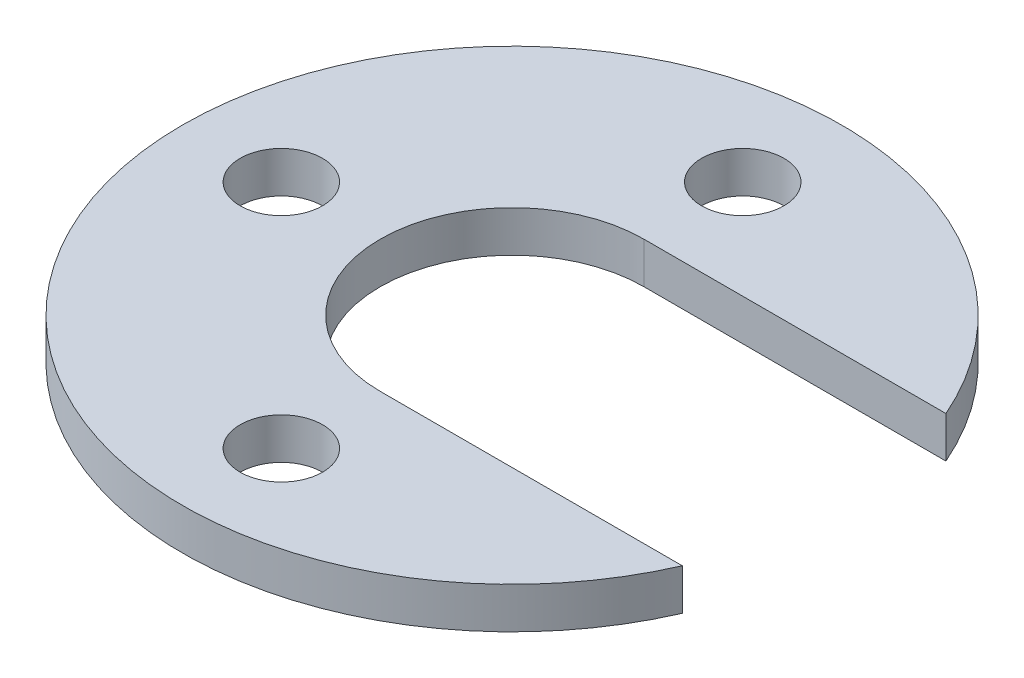
ISO-10303-21;
HEADER;
FILE_DESCRIPTION(('STEP AP214'),'2;1');
FILE_NAME('part.step','',(''),(''),'','','');
FILE_SCHEMA(('AUTOMOTIVE_DESIGN { 1 0 10303 214 1 1 1 1 }'));
ENDSEC;
DATA;
#1=APPLICATION_CONTEXT('core data for automotive mechanical design processes');
#2=APPLICATION_PROTOCOL_DEFINITION('international standard','automotive_design',2000,#1);
#3=PRODUCT_CONTEXT('',#1,'mechanical');
#4=PRODUCT('Part','Part','',(#3));
#5=PRODUCT_RELATED_PRODUCT_CATEGORY('part','',(#4));
#6=PRODUCT_DEFINITION_FORMATION('','',#4);
#7=PRODUCT_DEFINITION_CONTEXT('part definition',#1,'design');
#8=PRODUCT_DEFINITION('design','',#6,#7);
#9=PRODUCT_DEFINITION_SHAPE('','',#8);
#10=(LENGTH_UNIT() NAMED_UNIT(*) SI_UNIT(.MILLI.,.METRE.));
#11=(NAMED_UNIT(*) PLANE_ANGLE_UNIT() SI_UNIT($,.RADIAN.));
#12=(NAMED_UNIT(*) SI_UNIT($,.STERADIAN.) SOLID_ANGLE_UNIT());
#13=UNCERTAINTY_MEASURE_WITH_UNIT(LENGTH_MEASURE(1.E-05),#10,'distance_accuracy_value','');
#14=(GEOMETRIC_REPRESENTATION_CONTEXT(3) GLOBAL_UNCERTAINTY_ASSIGNED_CONTEXT((#13)) GLOBAL_UNIT_ASSIGNED_CONTEXT((#10,
#11,#12)) REPRESENTATION_CONTEXT('',''));
#15=CARTESIAN_POINT('',(0.,0.,0.));
#16=DIRECTION('',(0.,0.,1.));
#17=DIRECTION('',(1.,0.,0.));
#18=AXIS2_PLACEMENT_3D('',#15,#16,#17);
#19=CARTESIAN_POINT('',(0.,5.,0.));
#20=DIRECTION('',(0.,1.,0.));
#21=DIRECTION('',(0.,0.,1.));
#22=AXIS2_PLACEMENT_3D('',#19,#20,#21);
#23=PLANE('',#22);
#24=CARTESIAN_POINT('',(-1.88404347822423E-13,5.,28.));
#25=DIRECTION('',(0.,1.,0.));
#26=DIRECTION('',(0.,0.,1.));
#27=AXIS2_PLACEMENT_3D('',#24,#25,#26);
#28=CIRCLE('',#27,5.);
#29=CARTESIAN_POINT('',(-1.88404347822423E-13,5.,33.));
#30=VERTEX_POINT('',#29);
#31=EDGE_CURVE('E119',#30,#30,#28,.T.);
#32=ORIENTED_EDGE('',*,*,#31,.F.);
#33=EDGE_LOOP('',(#32));
#34=FACE_BOUND('',#33,.T.);
#35=CARTESIAN_POINT('',(0.,5.,0.));
#36=DIRECTION('',(0.,-1.,0.));
#37=DIRECTION('',(0.,0.,1.));
#38=AXIS2_PLACEMENT_3D('',#35,#36,#37);
#39=CIRCLE('',#38,16.);
#40=CARTESIAN_POINT('',(0.,5.,16.));
#41=VERTEX_POINT('',#40);
#42=CARTESIAN_POINT('',(0.,5.,-16.));
#43=VERTEX_POINT('',#42);
#44=EDGE_CURVE('E89',#41,#43,#39,.T.);
#45=ORIENTED_EDGE('',*,*,#44,.T.);
#46=DIRECTION('',(1.,0.,0.));
#47=VECTOR('',#46,1.);
#48=CARTESIAN_POINT('',(0.,5.,-16.));
#49=LINE('',#48,#47);
#50=CARTESIAN_POINT('',(36.6606055596467,5.,-16.));
#51=VERTEX_POINT('',#50);
#52=EDGE_CURVE('E84',#43,#51,#49,.T.);
#53=ORIENTED_EDGE('',*,*,#52,.T.);
#54=CARTESIAN_POINT('',(0.,5.,0.));
#55=DIRECTION('',(0.,1.,0.));
#56=DIRECTION('',(0.,0.,1.));
#57=AXIS2_PLACEMENT_3D('',#54,#55,#56);
#58=CIRCLE('',#57,40.);
#59=CARTESIAN_POINT('',(36.6606055596467,5.,16.));
#60=VERTEX_POINT('',#59);
#61=EDGE_CURVE('E87',#51,#60,#58,.T.);
#62=ORIENTED_EDGE('',*,*,#61,.T.);
#63=DIRECTION('',(-1.,0.,0.));
#64=VECTOR('',#63,1.);
#65=CARTESIAN_POINT('',(0.,5.,16.));
#66=LINE('',#65,#64);
#67=EDGE_CURVE('E54',#60,#41,#66,.T.);
#68=ORIENTED_EDGE('',*,*,#67,.T.);
#69=EDGE_LOOP('',(#45,#53,#62,#68));
#70=FACE_BOUND('',#69,.T.);
#71=CARTESIAN_POINT('',(0.,5.,-28.));
#72=DIRECTION('',(0.,1.,0.));
#73=DIRECTION('',(0.,0.,1.));
#74=AXIS2_PLACEMENT_3D('',#71,#72,#73);
#75=CIRCLE('',#74,5.);
#76=CARTESIAN_POINT('',(0.,5.,-23.));
#77=VERTEX_POINT('',#76);
#78=EDGE_CURVE('E104',#77,#77,#75,.T.);
#79=ORIENTED_EDGE('',*,*,#78,.F.);
#80=EDGE_LOOP('',(#79));
#81=FACE_BOUND('',#80,.T.);
#82=CARTESIAN_POINT('',(-28.,5.,-2.82696378358077E-13));
#83=DIRECTION('',(0.,1.,0.));
#84=DIRECTION('',(0.,0.,1.));
#85=AXIS2_PLACEMENT_3D('',#82,#83,#84);
#86=CIRCLE('',#85,5.);
#87=CARTESIAN_POINT('',(-28.,5.,4.99999999999972));
#88=VERTEX_POINT('',#87);
#89=EDGE_CURVE('E125',#88,#88,#86,.T.);
#90=ORIENTED_EDGE('',*,*,#89,.F.);
#91=EDGE_LOOP('',(#90));
#92=FACE_BOUND('',#91,.T.);
#93=ADVANCED_FACE('F37',(#34,#70,#81,#92),#23,.T.);
#94=CARTESIAN_POINT('',(0.,0.,0.));
#95=DIRECTION('',(0.,1.,0.));
#96=DIRECTION('',(0.,0.,1.));
#97=AXIS2_PLACEMENT_3D('',#94,#95,#96);
#98=PLANE('',#97);
#99=CARTESIAN_POINT('',(0.,0.,0.));
#100=DIRECTION('',(0.,-1.,0.));
#101=DIRECTION('',(0.,0.,1.));
#102=AXIS2_PLACEMENT_3D('',#99,#100,#101);
#103=CIRCLE('',#102,16.);
#104=CARTESIAN_POINT('',(0.,0.,16.));
#105=VERTEX_POINT('',#104);
#106=CARTESIAN_POINT('',(0.,0.,-16.));
#107=VERTEX_POINT('',#106);
#108=EDGE_CURVE('E101',#105,#107,#103,.T.);
#109=ORIENTED_EDGE('',*,*,#108,.F.);
#110=DIRECTION('',(-1.,0.,0.));
#111=VECTOR('',#110,1.);
#112=CARTESIAN_POINT('',(0.,0.,16.));
#113=LINE('',#112,#111);
#114=CARTESIAN_POINT('',(36.6606055596467,0.,16.));
#115=VERTEX_POINT('',#114);
#116=EDGE_CURVE('E77',#115,#105,#113,.T.);
#117=ORIENTED_EDGE('',*,*,#116,.F.);
#118=CARTESIAN_POINT('',(0.,0.,0.));
#119=DIRECTION('',(0.,1.,0.));
#120=DIRECTION('',(0.,0.,1.));
#121=AXIS2_PLACEMENT_3D('',#118,#119,#120);
#122=CIRCLE('',#121,40.);
#123=CARTESIAN_POINT('',(36.6606055596467,0.,-16.));
#124=VERTEX_POINT('',#123);
#125=EDGE_CURVE('E71',#124,#115,#122,.T.);
#126=ORIENTED_EDGE('',*,*,#125,.F.);
#127=DIRECTION('',(1.,0.,0.));
#128=VECTOR('',#127,1.);
#129=CARTESIAN_POINT('',(0.,0.,-16.));
#130=LINE('',#129,#128);
#131=EDGE_CURVE('E93',#107,#124,#130,.T.);
#132=ORIENTED_EDGE('',*,*,#131,.F.);
#133=EDGE_LOOP('',(#109,#117,#126,#132));
#134=FACE_BOUND('',#133,.T.);
#135=CARTESIAN_POINT('',(0.,0.,-28.));
#136=DIRECTION('',(0.,1.,0.));
#137=DIRECTION('',(0.,0.,1.));
#138=AXIS2_PLACEMENT_3D('',#135,#136,#137);
#139=CIRCLE('',#138,5.);
#140=CARTESIAN_POINT('',(0.,0.,-23.));
#141=VERTEX_POINT('',#140);
#142=EDGE_CURVE('E116',#141,#141,#139,.T.);
#143=ORIENTED_EDGE('',*,*,#142,.T.);
#144=EDGE_LOOP('',(#143));
#145=FACE_BOUND('',#144,.T.);
#146=CARTESIAN_POINT('',(-1.88404347822423E-13,0.,28.));
#147=DIRECTION('',(0.,1.,0.));
#148=DIRECTION('',(0.,0.,1.));
#149=AXIS2_PLACEMENT_3D('',#146,#147,#148);
#150=CIRCLE('',#149,5.);
#151=CARTESIAN_POINT('',(-1.88404347822423E-13,0.,33.));
#152=VERTEX_POINT('',#151);
#153=EDGE_CURVE('E122',#152,#152,#150,.T.);
#154=ORIENTED_EDGE('',*,*,#153,.T.);
#155=EDGE_LOOP('',(#154));
#156=FACE_BOUND('',#155,.T.);
#157=CARTESIAN_POINT('',(-28.,0.,-2.82696378358077E-13));
#158=DIRECTION('',(0.,1.,0.));
#159=DIRECTION('',(0.,0.,1.));
#160=AXIS2_PLACEMENT_3D('',#157,#158,#159);
#161=CIRCLE('',#160,5.);
#162=CARTESIAN_POINT('',(-28.,0.,4.99999999999972));
#163=VERTEX_POINT('',#162);
#164=EDGE_CURVE('E128',#163,#163,#161,.T.);
#165=ORIENTED_EDGE('',*,*,#164,.T.);
#166=EDGE_LOOP('',(#165));
#167=FACE_BOUND('',#166,.T.);
#168=ADVANCED_FACE('F112',(#134,#145,#156,#167),#98,.F.);
#169=CARTESIAN_POINT('',(0.,5.,0.));
#170=DIRECTION('',(0.,-1.,0.));
#171=DIRECTION('',(0.,0.,-1.));
#172=AXIS2_PLACEMENT_3D('',#169,#170,#171);
#173=CYLINDRICAL_SURFACE('',#172,16.);
#174=ORIENTED_EDGE('',*,*,#108,.T.);
#175=DIRECTION('',(0.,-1.,0.));
#176=VECTOR('',#175,1.);
#177=CARTESIAN_POINT('',(0.,5.,-16.));
#178=LINE('',#177,#176);
#179=EDGE_CURVE('E11',#43,#107,#178,.T.);
#180=ORIENTED_EDGE('',*,*,#179,.F.);
#181=ORIENTED_EDGE('',*,*,#44,.F.);
#182=DIRECTION('',(0.,-1.,0.));
#183=VECTOR('',#182,1.);
#184=CARTESIAN_POINT('',(0.,5.,16.));
#185=LINE('',#184,#183);
#186=EDGE_CURVE('E97',#41,#105,#185,.T.);
#187=ORIENTED_EDGE('',*,*,#186,.T.);
#188=EDGE_LOOP('',(#174,#180,#181,#187));
#189=FACE_BOUND('',#188,.T.);
#190=ADVANCED_FACE('F39',(#189),#173,.F.);
#191=CARTESIAN_POINT('',(0.,5.,-16.));
#192=DIRECTION('',(0.,0.,-1.));
#193=DIRECTION('',(-1.,0.,0.));
#194=AXIS2_PLACEMENT_3D('',#191,#192,#193);
#195=PLANE('',#194);
#196=ORIENTED_EDGE('',*,*,#131,.T.);
#197=DIRECTION('',(0.,-1.,0.));
#198=VECTOR('',#197,1.);
#199=CARTESIAN_POINT('',(36.6606055596467,5.,-16.));
#200=LINE('',#199,#198);
#201=EDGE_CURVE('E46',#51,#124,#200,.T.);
#202=ORIENTED_EDGE('',*,*,#201,.F.);
#203=ORIENTED_EDGE('',*,*,#52,.F.);
#204=ORIENTED_EDGE('',*,*,#179,.T.);
#205=EDGE_LOOP('',(#196,#202,#203,#204));
#206=FACE_BOUND('',#205,.T.);
#207=ADVANCED_FACE('F92',(#206),#195,.F.);
#208=CARTESIAN_POINT('',(0.,5.,0.));
#209=DIRECTION('',(0.,-1.,0.));
#210=DIRECTION('',(0.,0.,-1.));
#211=AXIS2_PLACEMENT_3D('',#208,#209,#210);
#212=CYLINDRICAL_SURFACE('',#211,40.);
#213=ORIENTED_EDGE('',*,*,#125,.T.);
#214=DIRECTION('',(0.,-1.,0.));
#215=VECTOR('',#214,1.);
#216=CARTESIAN_POINT('',(36.6606055596467,5.,16.));
#217=LINE('',#216,#215);
#218=EDGE_CURVE('E94',#60,#115,#217,.T.);
#219=ORIENTED_EDGE('',*,*,#218,.F.);
#220=ORIENTED_EDGE('',*,*,#61,.F.);
#221=ORIENTED_EDGE('',*,*,#201,.T.);
#222=EDGE_LOOP('',(#213,#219,#220,#221));
#223=FACE_BOUND('',#222,.T.);
#224=ADVANCED_FACE('F95',(#223),#212,.T.);
#225=CARTESIAN_POINT('',(0.,5.,16.));
#226=DIRECTION('',(0.,0.,1.));
#227=DIRECTION('',(1.,0.,0.));
#228=AXIS2_PLACEMENT_3D('',#225,#226,#227);
#229=PLANE('',#228);
#230=ORIENTED_EDGE('',*,*,#116,.T.);
#231=ORIENTED_EDGE('',*,*,#186,.F.);
#232=ORIENTED_EDGE('',*,*,#67,.F.);
#233=ORIENTED_EDGE('',*,*,#218,.T.);
#234=EDGE_LOOP('',(#230,#231,#232,#233));
#235=FACE_BOUND('',#234,.T.);
#236=ADVANCED_FACE('F109',(#235),#229,.F.);
#237=CARTESIAN_POINT('',(0.,5.,-28.));
#238=DIRECTION('',(0.,-1.,0.));
#239=DIRECTION('',(0.,0.,-1.));
#240=AXIS2_PLACEMENT_3D('',#237,#238,#239);
#241=CYLINDRICAL_SURFACE('',#240,5.);
#242=ORIENTED_EDGE('',*,*,#78,.T.);
#243=EDGE_LOOP('',(#242));
#244=FACE_BOUND('',#243,.T.);
#245=ORIENTED_EDGE('',*,*,#142,.F.);
#246=EDGE_LOOP('',(#245));
#247=FACE_BOUND('',#246,.T.);
#248=ADVANCED_FACE('F146',(#244,#247),#241,.F.);
#249=CARTESIAN_POINT('',(-1.88404347822423E-13,5.,28.));
#250=DIRECTION('',(0.,-1.,0.));
#251=DIRECTION('',(0.,0.,-1.));
#252=AXIS2_PLACEMENT_3D('',#249,#250,#251);
#253=CYLINDRICAL_SURFACE('',#252,5.);
#254=ORIENTED_EDGE('',*,*,#31,.T.);
#255=EDGE_LOOP('',(#254));
#256=FACE_BOUND('',#255,.T.);
#257=ORIENTED_EDGE('',*,*,#153,.F.);
#258=EDGE_LOOP('',(#257));
#259=FACE_BOUND('',#258,.T.);
#260=ADVANCED_FACE('F200',(#256,#259),#253,.F.);
#261=CARTESIAN_POINT('',(-28.,5.,-2.82696378358077E-13));
#262=DIRECTION('',(0.,-1.,0.));
#263=DIRECTION('',(0.,0.,-1.));
#264=AXIS2_PLACEMENT_3D('',#261,#262,#263);
#265=CYLINDRICAL_SURFACE('',#264,5.);
#266=ORIENTED_EDGE('',*,*,#89,.T.);
#267=EDGE_LOOP('',(#266));
#268=FACE_BOUND('',#267,.T.);
#269=ORIENTED_EDGE('',*,*,#164,.F.);
#270=EDGE_LOOP('',(#269));
#271=FACE_BOUND('',#270,.T.);
#272=ADVANCED_FACE('F134',(#268,#271),#265,.F.);
#273=CLOSED_SHELL('',(#93,#168,#190,#207,#224,#236,#248,#260,#272));
#274=MANIFOLD_SOLID_BREP('B2',#273);
#275=ADVANCED_BREP_SHAPE_REPRESENTATION('',(#18,#274),#14);
#276=SHAPE_DEFINITION_REPRESENTATION(#9,#275);
ENDSEC;
END-ISO-10303-21;
